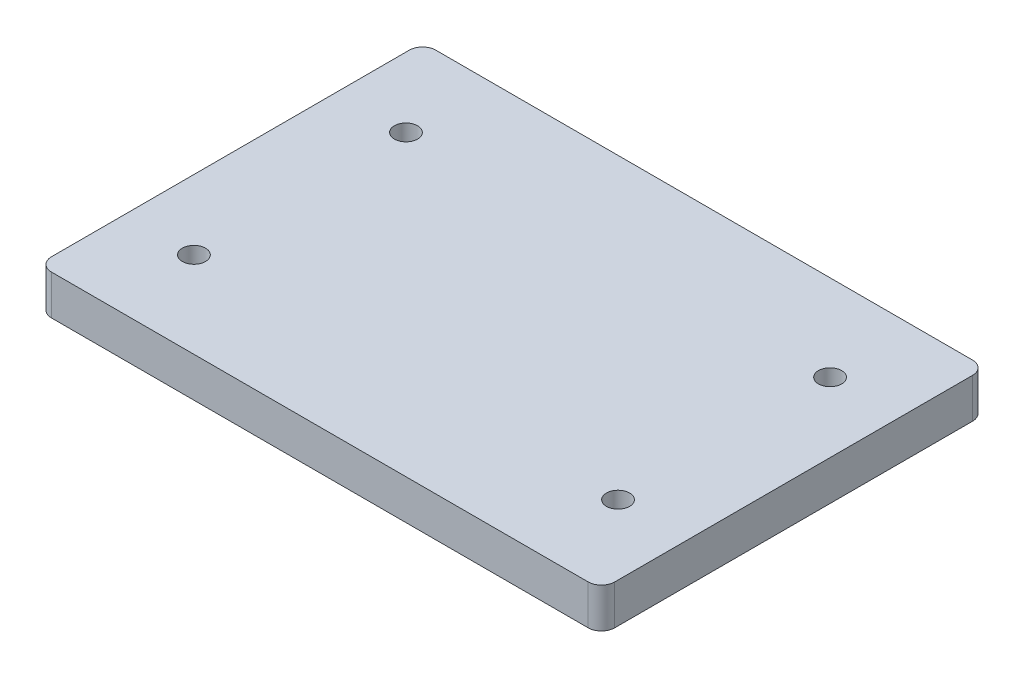
ISO-10303-21;
HEADER;
FILE_DESCRIPTION(('STEP AP214'),'2;1');
FILE_NAME('part.step','',(''),(''),'','','');
FILE_SCHEMA(('AUTOMOTIVE_DESIGN { 1 0 10303 214 1 1 1 1 }'));
ENDSEC;
DATA;
#1=APPLICATION_CONTEXT('core data for automotive mechanical design processes');
#2=APPLICATION_PROTOCOL_DEFINITION('international standard','automotive_design',2000,#1);
#3=PRODUCT_CONTEXT('',#1,'mechanical');
#4=PRODUCT('Part','Part','',(#3));
#5=PRODUCT_RELATED_PRODUCT_CATEGORY('part','',(#4));
#6=PRODUCT_DEFINITION_FORMATION('','',#4);
#7=PRODUCT_DEFINITION_CONTEXT('part definition',#1,'design');
#8=PRODUCT_DEFINITION('design','',#6,#7);
#9=PRODUCT_DEFINITION_SHAPE('','',#8);
#10=(LENGTH_UNIT() NAMED_UNIT(*) SI_UNIT(.MILLI.,.METRE.));
#11=(NAMED_UNIT(*) PLANE_ANGLE_UNIT() SI_UNIT($,.RADIAN.));
#12=(NAMED_UNIT(*) SI_UNIT($,.STERADIAN.) SOLID_ANGLE_UNIT());
#13=UNCERTAINTY_MEASURE_WITH_UNIT(LENGTH_MEASURE(1.E-05),#10,'distance_accuracy_value','');
#14=(GEOMETRIC_REPRESENTATION_CONTEXT(3) GLOBAL_UNCERTAINTY_ASSIGNED_CONTEXT((#13)) GLOBAL_UNIT_ASSIGNED_CONTEXT((#10,
#11,#12)) REPRESENTATION_CONTEXT('',''));
#15=CARTESIAN_POINT('',(0.,0.,0.));
#16=DIRECTION('',(0.,0.,1.));
#17=DIRECTION('',(1.,0.,0.));
#18=AXIS2_PLACEMENT_3D('',#15,#16,#17);
#19=CARTESIAN_POINT('',(42.5,6.,29.));
#20=DIRECTION('',(-1.,0.,0.));
#21=DIRECTION('',(0.,0.,1.));
#22=AXIS2_PLACEMENT_3D('',#19,#20,#21);
#23=PLANE('',#22);
#24=DIRECTION('',(0.,0.,-1.));
#25=VECTOR('',#24,1.);
#26=CARTESIAN_POINT('',(42.5,0.,29.));
#27=LINE('',#26,#25);
#28=CARTESIAN_POINT('',(42.5,0.,27.));
#29=VERTEX_POINT('',#28);
#30=CARTESIAN_POINT('',(42.5,0.,-27.));
#31=VERTEX_POINT('',#30);
#32=EDGE_CURVE('E136',#29,#31,#27,.T.);
#33=ORIENTED_EDGE('',*,*,#32,.T.);
#34=DIRECTION('',(0.,-1.,0.));
#35=VECTOR('',#34,1.);
#36=CARTESIAN_POINT('',(42.5,6.,-27.));
#37=LINE('',#36,#35);
#38=CARTESIAN_POINT('',(42.5,6.,-27.));
#39=VERTEX_POINT('',#38);
#40=EDGE_CURVE('E159',#31,#39,#37,.F.);
#41=ORIENTED_EDGE('',*,*,#40,.T.);
#42=DIRECTION('',(0.,0.,-1.));
#43=VECTOR('',#42,1.);
#44=CARTESIAN_POINT('',(42.5,6.,29.));
#45=LINE('',#44,#43);
#46=CARTESIAN_POINT('',(42.5,6.,27.));
#47=VERTEX_POINT('',#46);
#48=EDGE_CURVE('E134',#47,#39,#45,.T.);
#49=ORIENTED_EDGE('',*,*,#48,.F.);
#50=DIRECTION('',(0.,-1.,0.));
#51=VECTOR('',#50,1.);
#52=CARTESIAN_POINT('',(42.5,6.,27.));
#53=LINE('',#52,#51);
#54=EDGE_CURVE('E156',#47,#29,#53,.T.);
#55=ORIENTED_EDGE('',*,*,#54,.T.);
#56=EDGE_LOOP('',(#33,#41,#49,#55));
#57=FACE_BOUND('',#56,.T.);
#58=ADVANCED_FACE('F41',(#57),#23,.F.);
#59=CARTESIAN_POINT('',(-42.5,6.,-29.));
#60=DIRECTION('',(0.,0.,1.));
#61=DIRECTION('',(1.,0.,0.));
#62=AXIS2_PLACEMENT_3D('',#59,#60,#61);
#63=PLANE('',#62);
#64=DIRECTION('',(-1.,0.,0.));
#65=VECTOR('',#64,1.);
#66=CARTESIAN_POINT('',(-42.5,0.,-29.));
#67=LINE('',#66,#65);
#68=CARTESIAN_POINT('',(40.5,0.,-29.));
#69=VERTEX_POINT('',#68);
#70=CARTESIAN_POINT('',(-40.5,0.,-29.));
#71=VERTEX_POINT('',#70);
#72=EDGE_CURVE('E132',#69,#71,#67,.T.);
#73=ORIENTED_EDGE('',*,*,#72,.T.);
#74=DIRECTION('',(0.,-1.,0.));
#75=VECTOR('',#74,1.);
#76=CARTESIAN_POINT('',(-40.5,6.,-29.));
#77=LINE('',#76,#75);
#78=CARTESIAN_POINT('',(-40.5,6.,-29.));
#79=VERTEX_POINT('',#78);
#80=EDGE_CURVE('E111',#71,#79,#77,.F.);
#81=ORIENTED_EDGE('',*,*,#80,.T.);
#82=DIRECTION('',(-1.,0.,0.));
#83=VECTOR('',#82,1.);
#84=CARTESIAN_POINT('',(-42.5,6.,-29.));
#85=LINE('',#84,#83);
#86=CARTESIAN_POINT('',(40.5,6.,-29.));
#87=VERTEX_POINT('',#86);
#88=EDGE_CURVE('E175',#87,#79,#85,.T.);
#89=ORIENTED_EDGE('',*,*,#88,.F.);
#90=DIRECTION('',(0.,-1.,0.));
#91=VECTOR('',#90,1.);
#92=CARTESIAN_POINT('',(40.5,6.,-29.));
#93=LINE('',#92,#91);
#94=EDGE_CURVE('E116',#87,#69,#93,.T.);
#95=ORIENTED_EDGE('',*,*,#94,.T.);
#96=EDGE_LOOP('',(#73,#81,#89,#95));
#97=FACE_BOUND('',#96,.T.);
#98=ADVANCED_FACE('F220',(#97),#63,.F.);
#99=CARTESIAN_POINT('',(-42.5,6.,29.));
#100=DIRECTION('',(1.,0.,0.));
#101=DIRECTION('',(0.,0.,-1.));
#102=AXIS2_PLACEMENT_3D('',#99,#100,#101);
#103=PLANE('',#102);
#104=DIRECTION('',(0.,0.,1.));
#105=VECTOR('',#104,1.);
#106=CARTESIAN_POINT('',(-42.5,6.,29.));
#107=LINE('',#106,#105);
#108=CARTESIAN_POINT('',(-42.5,6.,-27.));
#109=VERTEX_POINT('',#108);
#110=CARTESIAN_POINT('',(-42.5,6.,27.));
#111=VERTEX_POINT('',#110);
#112=EDGE_CURVE('E125',#109,#111,#107,.T.);
#113=ORIENTED_EDGE('',*,*,#112,.F.);
#114=DIRECTION('',(0.,-1.,0.));
#115=VECTOR('',#114,1.);
#116=CARTESIAN_POINT('',(-42.5,6.,-27.));
#117=LINE('',#116,#115);
#118=CARTESIAN_POINT('',(-42.5,0.,-27.));
#119=VERTEX_POINT('',#118);
#120=EDGE_CURVE('E110',#109,#119,#117,.T.);
#121=ORIENTED_EDGE('',*,*,#120,.T.);
#122=DIRECTION('',(0.,0.,1.));
#123=VECTOR('',#122,1.);
#124=CARTESIAN_POINT('',(-42.5,0.,29.));
#125=LINE('',#124,#123);
#126=CARTESIAN_POINT('',(-42.5,0.,27.));
#127=VERTEX_POINT('',#126);
#128=EDGE_CURVE('E123',#119,#127,#125,.T.);
#129=ORIENTED_EDGE('',*,*,#128,.T.);
#130=DIRECTION('',(0.,-1.,0.));
#131=VECTOR('',#130,1.);
#132=CARTESIAN_POINT('',(-42.5,6.,27.));
#133=LINE('',#132,#131);
#134=EDGE_CURVE('E127',#127,#111,#133,.F.);
#135=ORIENTED_EDGE('',*,*,#134,.T.);
#136=EDGE_LOOP('',(#113,#121,#129,#135));
#137=FACE_BOUND('',#136,.T.);
#138=ADVANCED_FACE('F122',(#137),#103,.F.);
#139=CARTESIAN_POINT('',(-42.5,6.,29.));
#140=DIRECTION('',(0.,0.,-1.));
#141=DIRECTION('',(-1.,0.,0.));
#142=AXIS2_PLACEMENT_3D('',#139,#140,#141);
#143=PLANE('',#142);
#144=DIRECTION('',(1.,0.,0.));
#145=VECTOR('',#144,1.);
#146=CARTESIAN_POINT('',(-42.5,0.,29.));
#147=LINE('',#146,#145);
#148=CARTESIAN_POINT('',(-40.5,0.,29.));
#149=VERTEX_POINT('',#148);
#150=CARTESIAN_POINT('',(40.5,0.,29.));
#151=VERTEX_POINT('',#150);
#152=EDGE_CURVE('E131',#149,#151,#147,.T.);
#153=ORIENTED_EDGE('',*,*,#152,.T.);
#154=DIRECTION('',(0.,-1.,0.));
#155=VECTOR('',#154,1.);
#156=CARTESIAN_POINT('',(40.5,6.,29.));
#157=LINE('',#156,#155);
#158=CARTESIAN_POINT('',(40.5,6.,29.));
#159=VERTEX_POINT('',#158);
#160=EDGE_CURVE('E11',#151,#159,#157,.F.);
#161=ORIENTED_EDGE('',*,*,#160,.T.);
#162=DIRECTION('',(1.,0.,0.));
#163=VECTOR('',#162,1.);
#164=CARTESIAN_POINT('',(-42.5,6.,29.));
#165=LINE('',#164,#163);
#166=CARTESIAN_POINT('',(-40.5,6.,29.));
#167=VERTEX_POINT('',#166);
#168=EDGE_CURVE('E140',#167,#159,#165,.T.);
#169=ORIENTED_EDGE('',*,*,#168,.F.);
#170=DIRECTION('',(0.,-1.,0.));
#171=VECTOR('',#170,1.);
#172=CARTESIAN_POINT('',(-40.5,6.,29.));
#173=LINE('',#172,#171);
#174=EDGE_CURVE('E49',#167,#149,#173,.T.);
#175=ORIENTED_EDGE('',*,*,#174,.T.);
#176=EDGE_LOOP('',(#153,#161,#169,#175));
#177=FACE_BOUND('',#176,.T.);
#178=ADVANCED_FACE('F162',(#177),#143,.F.);
#179=CARTESIAN_POINT('',(0.,6.,0.));
#180=DIRECTION('',(0.,-1.,0.));
#181=DIRECTION('',(0.,0.,-1.));
#182=AXIS2_PLACEMENT_3D('',#179,#180,#181);
#183=PLANE('',#182);
#184=CARTESIAN_POINT('',(-32.,6.,16.));
#185=DIRECTION('',(0.,1.,0.));
#186=DIRECTION('',(0.,0.,-1.));
#187=AXIS2_PLACEMENT_3D('',#184,#185,#186);
#188=CIRCLE('',#187,1.75);
#189=CARTESIAN_POINT('',(-32.,6.,14.25));
#190=VERTEX_POINT('',#189);
#191=EDGE_CURVE('E194',#190,#190,#188,.T.);
#192=ORIENTED_EDGE('',*,*,#191,.F.);
#193=EDGE_LOOP('',(#192));
#194=FACE_BOUND('',#193,.T.);
#195=CARTESIAN_POINT('',(32.,6.,16.));
#196=DIRECTION('',(0.,1.,0.));
#197=DIRECTION('',(0.,0.,1.));
#198=AXIS2_PLACEMENT_3D('',#195,#196,#197);
#199=CIRCLE('',#198,1.75);
#200=CARTESIAN_POINT('',(32.,6.,17.75));
#201=VERTEX_POINT('',#200);
#202=EDGE_CURVE('E200',#201,#201,#199,.T.);
#203=ORIENTED_EDGE('',*,*,#202,.F.);
#204=EDGE_LOOP('',(#203));
#205=FACE_BOUND('',#204,.T.);
#206=CARTESIAN_POINT('',(32.,6.,-16.));
#207=DIRECTION('',(0.,1.,0.));
#208=DIRECTION('',(0.,0.,-1.));
#209=AXIS2_PLACEMENT_3D('',#206,#207,#208);
#210=CIRCLE('',#209,1.75);
#211=CARTESIAN_POINT('',(32.,6.,-17.75));
#212=VERTEX_POINT('',#211);
#213=EDGE_CURVE('E189',#212,#212,#210,.T.);
#214=ORIENTED_EDGE('',*,*,#213,.F.);
#215=EDGE_LOOP('',(#214));
#216=FACE_BOUND('',#215,.T.);
#217=CARTESIAN_POINT('',(-32.,6.,-16.));
#218=DIRECTION('',(0.,1.,0.));
#219=DIRECTION('',(0.,0.,1.));
#220=AXIS2_PLACEMENT_3D('',#217,#218,#219);
#221=CIRCLE('',#220,1.75);
#222=CARTESIAN_POINT('',(-32.,6.,-14.25));
#223=VERTEX_POINT('',#222);
#224=EDGE_CURVE('E180',#223,#223,#221,.T.);
#225=ORIENTED_EDGE('',*,*,#224,.F.);
#226=EDGE_LOOP('',(#225));
#227=FACE_BOUND('',#226,.T.);
#228=ORIENTED_EDGE('',*,*,#88,.T.);
#229=CARTESIAN_POINT('',(-40.5,6.,-27.));
#230=DIRECTION('',(0.,-1.,0.));
#231=DIRECTION('',(0.,0.,-1.));
#232=AXIS2_PLACEMENT_3D('',#229,#230,#231);
#233=CIRCLE('',#232,2.);
#234=EDGE_CURVE('E154',#79,#109,#233,.F.);
#235=ORIENTED_EDGE('',*,*,#234,.T.);
#236=ORIENTED_EDGE('',*,*,#112,.T.);
#237=CARTESIAN_POINT('',(-40.5,6.,27.));
#238=DIRECTION('',(0.,-1.,0.));
#239=DIRECTION('',(0.,0.,-1.));
#240=AXIS2_PLACEMENT_3D('',#237,#238,#239);
#241=CIRCLE('',#240,2.);
#242=EDGE_CURVE('E61',#111,#167,#241,.F.);
#243=ORIENTED_EDGE('',*,*,#242,.T.);
#244=ORIENTED_EDGE('',*,*,#168,.T.);
#245=CARTESIAN_POINT('',(40.5,6.,27.));
#246=DIRECTION('',(0.,-1.,0.));
#247=DIRECTION('',(0.,0.,-1.));
#248=AXIS2_PLACEMENT_3D('',#245,#246,#247);
#249=CIRCLE('',#248,2.);
#250=EDGE_CURVE('E150',#159,#47,#249,.F.);
#251=ORIENTED_EDGE('',*,*,#250,.T.);
#252=ORIENTED_EDGE('',*,*,#48,.T.);
#253=CARTESIAN_POINT('',(40.5,6.,-27.));
#254=DIRECTION('',(0.,-1.,0.));
#255=DIRECTION('',(0.,0.,-1.));
#256=AXIS2_PLACEMENT_3D('',#253,#254,#255);
#257=CIRCLE('',#256,2.);
#258=EDGE_CURVE('E152',#39,#87,#257,.F.);
#259=ORIENTED_EDGE('',*,*,#258,.T.);
#260=EDGE_LOOP('',(#228,#235,#236,#243,#244,#251,#252,#259));
#261=FACE_BOUND('',#260,.T.);
#262=ADVANCED_FACE('F211',(#194,#205,#216,#227,#261),#183,.F.);
#263=CARTESIAN_POINT('',(0.,0.,0.));
#264=DIRECTION('',(0.,-1.,0.));
#265=DIRECTION('',(0.,0.,-1.));
#266=AXIS2_PLACEMENT_3D('',#263,#264,#265);
#267=PLANE('',#266);
#268=CARTESIAN_POINT('',(-32.,0.,16.));
#269=DIRECTION('',(0.,1.,0.));
#270=DIRECTION('',(0.,0.,-1.));
#271=AXIS2_PLACEMENT_3D('',#268,#269,#270);
#272=CIRCLE('',#271,1.75);
#273=CARTESIAN_POINT('',(-32.,0.,14.25));
#274=VERTEX_POINT('',#273);
#275=EDGE_CURVE('E191',#274,#274,#272,.T.);
#276=ORIENTED_EDGE('',*,*,#275,.T.);
#277=EDGE_LOOP('',(#276));
#278=FACE_BOUND('',#277,.T.);
#279=CARTESIAN_POINT('',(32.,0.,16.));
#280=DIRECTION('',(0.,1.,0.));
#281=DIRECTION('',(0.,0.,1.));
#282=AXIS2_PLACEMENT_3D('',#279,#280,#281);
#283=CIRCLE('',#282,1.75);
#284=CARTESIAN_POINT('',(32.,0.,17.75));
#285=VERTEX_POINT('',#284);
#286=EDGE_CURVE('E197',#285,#285,#283,.T.);
#287=ORIENTED_EDGE('',*,*,#286,.T.);
#288=EDGE_LOOP('',(#287));
#289=FACE_BOUND('',#288,.T.);
#290=CARTESIAN_POINT('',(32.,0.,-16.));
#291=DIRECTION('',(0.,1.,0.));
#292=DIRECTION('',(0.,0.,-1.));
#293=AXIS2_PLACEMENT_3D('',#290,#291,#292);
#294=CIRCLE('',#293,1.75);
#295=CARTESIAN_POINT('',(32.,0.,-17.75));
#296=VERTEX_POINT('',#295);
#297=EDGE_CURVE('E203',#296,#296,#294,.T.);
#298=ORIENTED_EDGE('',*,*,#297,.T.);
#299=EDGE_LOOP('',(#298));
#300=FACE_BOUND('',#299,.T.);
#301=CARTESIAN_POINT('',(-32.,0.,-16.));
#302=DIRECTION('',(0.,1.,0.));
#303=DIRECTION('',(0.,0.,1.));
#304=AXIS2_PLACEMENT_3D('',#301,#302,#303);
#305=CIRCLE('',#304,1.75);
#306=CARTESIAN_POINT('',(-32.,0.,-14.25));
#307=VERTEX_POINT('',#306);
#308=EDGE_CURVE('E184',#307,#307,#305,.T.);
#309=ORIENTED_EDGE('',*,*,#308,.T.);
#310=EDGE_LOOP('',(#309));
#311=FACE_BOUND('',#310,.T.);
#312=ORIENTED_EDGE('',*,*,#128,.F.);
#313=CARTESIAN_POINT('',(-40.5,0.,-27.));
#314=DIRECTION('',(0.,-1.,0.));
#315=DIRECTION('',(0.,0.,-1.));
#316=AXIS2_PLACEMENT_3D('',#313,#314,#315);
#317=CIRCLE('',#316,2.);
#318=EDGE_CURVE('E106',#119,#71,#317,.T.);
#319=ORIENTED_EDGE('',*,*,#318,.T.);
#320=ORIENTED_EDGE('',*,*,#72,.F.);
#321=CARTESIAN_POINT('',(40.5,0.,-27.));
#322=DIRECTION('',(0.,-1.,0.));
#323=DIRECTION('',(0.,0.,-1.));
#324=AXIS2_PLACEMENT_3D('',#321,#322,#323);
#325=CIRCLE('',#324,2.);
#326=EDGE_CURVE('E117',#69,#31,#325,.T.);
#327=ORIENTED_EDGE('',*,*,#326,.T.);
#328=ORIENTED_EDGE('',*,*,#32,.F.);
#329=CARTESIAN_POINT('',(40.5,0.,27.));
#330=DIRECTION('',(0.,-1.,0.));
#331=DIRECTION('',(0.,0.,-1.));
#332=AXIS2_PLACEMENT_3D('',#329,#330,#331);
#333=CIRCLE('',#332,2.);
#334=EDGE_CURVE('E143',#29,#151,#333,.T.);
#335=ORIENTED_EDGE('',*,*,#334,.T.);
#336=ORIENTED_EDGE('',*,*,#152,.F.);
#337=CARTESIAN_POINT('',(-40.5,0.,27.));
#338=DIRECTION('',(0.,-1.,0.));
#339=DIRECTION('',(0.,0.,-1.));
#340=AXIS2_PLACEMENT_3D('',#337,#338,#339);
#341=CIRCLE('',#340,2.);
#342=EDGE_CURVE('E126',#149,#127,#341,.T.);
#343=ORIENTED_EDGE('',*,*,#342,.T.);
#344=EDGE_LOOP('',(#312,#319,#320,#327,#328,#335,#336,#343));
#345=FACE_BOUND('',#344,.T.);
#346=ADVANCED_FACE('F129',(#278,#289,#300,#311,#345),#267,.T.);
#347=CARTESIAN_POINT('',(-40.5,6.,-27.));
#348=DIRECTION('',(0.,-1.,0.));
#349=DIRECTION('',(0.,0.,-1.));
#350=AXIS2_PLACEMENT_3D('',#347,#348,#349);
#351=CYLINDRICAL_SURFACE('',#350,2.);
#352=ORIENTED_EDGE('',*,*,#234,.F.);
#353=ORIENTED_EDGE('',*,*,#80,.F.);
#354=ORIENTED_EDGE('',*,*,#318,.F.);
#355=ORIENTED_EDGE('',*,*,#120,.F.);
#356=EDGE_LOOP('',(#352,#353,#354,#355));
#357=FACE_BOUND('',#356,.T.);
#358=ADVANCED_FACE('F109',(#357),#351,.T.);
#359=CARTESIAN_POINT('',(40.5,6.,-27.));
#360=DIRECTION('',(0.,-1.,0.));
#361=DIRECTION('',(0.,0.,-1.));
#362=AXIS2_PLACEMENT_3D('',#359,#360,#361);
#363=CYLINDRICAL_SURFACE('',#362,2.);
#364=ORIENTED_EDGE('',*,*,#258,.F.);
#365=ORIENTED_EDGE('',*,*,#40,.F.);
#366=ORIENTED_EDGE('',*,*,#326,.F.);
#367=ORIENTED_EDGE('',*,*,#94,.F.);
#368=EDGE_LOOP('',(#364,#365,#366,#367));
#369=FACE_BOUND('',#368,.T.);
#370=ADVANCED_FACE('F222',(#369),#363,.T.);
#371=CARTESIAN_POINT('',(40.5,6.,27.));
#372=DIRECTION('',(0.,-1.,0.));
#373=DIRECTION('',(0.,0.,-1.));
#374=AXIS2_PLACEMENT_3D('',#371,#372,#373);
#375=CYLINDRICAL_SURFACE('',#374,2.);
#376=ORIENTED_EDGE('',*,*,#250,.F.);
#377=ORIENTED_EDGE('',*,*,#160,.F.);
#378=ORIENTED_EDGE('',*,*,#334,.F.);
#379=ORIENTED_EDGE('',*,*,#54,.F.);
#380=EDGE_LOOP('',(#376,#377,#378,#379));
#381=FACE_BOUND('',#380,.T.);
#382=ADVANCED_FACE('F169',(#381),#375,.T.);
#383=CARTESIAN_POINT('',(-40.5,6.,27.));
#384=DIRECTION('',(0.,-1.,0.));
#385=DIRECTION('',(0.,0.,-1.));
#386=AXIS2_PLACEMENT_3D('',#383,#384,#385);
#387=CYLINDRICAL_SURFACE('',#386,2.);
#388=ORIENTED_EDGE('',*,*,#242,.F.);
#389=ORIENTED_EDGE('',*,*,#134,.F.);
#390=ORIENTED_EDGE('',*,*,#342,.F.);
#391=ORIENTED_EDGE('',*,*,#174,.F.);
#392=EDGE_LOOP('',(#388,#389,#390,#391));
#393=FACE_BOUND('',#392,.T.);
#394=ADVANCED_FACE('F43',(#393),#387,.T.);
#395=CARTESIAN_POINT('',(-32.,0.,-16.));
#396=DIRECTION('',(0.,1.,0.));
#397=DIRECTION('',(0.,0.,1.));
#398=AXIS2_PLACEMENT_3D('',#395,#396,#397);
#399=CYLINDRICAL_SURFACE('',#398,1.75);
#400=ORIENTED_EDGE('',*,*,#308,.F.);
#401=EDGE_LOOP('',(#400));
#402=FACE_BOUND('',#401,.T.);
#403=ORIENTED_EDGE('',*,*,#224,.T.);
#404=EDGE_LOOP('',(#403));
#405=FACE_BOUND('',#404,.T.);
#406=ADVANCED_FACE('F244',(#402,#405),#399,.F.);
#407=CARTESIAN_POINT('',(32.,0.,-16.));
#408=DIRECTION('',(0.,1.,0.));
#409=DIRECTION('',(0.,0.,1.));
#410=AXIS2_PLACEMENT_3D('',#407,#408,#409);
#411=CYLINDRICAL_SURFACE('',#410,1.75);
#412=ORIENTED_EDGE('',*,*,#297,.F.);
#413=EDGE_LOOP('',(#412));
#414=FACE_BOUND('',#413,.T.);
#415=ORIENTED_EDGE('',*,*,#213,.T.);
#416=EDGE_LOOP('',(#415));
#417=FACE_BOUND('',#416,.T.);
#418=ADVANCED_FACE('F209',(#414,#417),#411,.F.);
#419=CARTESIAN_POINT('',(32.,0.,16.));
#420=DIRECTION('',(0.,1.,0.));
#421=DIRECTION('',(0.,0.,1.));
#422=AXIS2_PLACEMENT_3D('',#419,#420,#421);
#423=CYLINDRICAL_SURFACE('',#422,1.75);
#424=ORIENTED_EDGE('',*,*,#286,.F.);
#425=EDGE_LOOP('',(#424));
#426=FACE_BOUND('',#425,.T.);
#427=ORIENTED_EDGE('',*,*,#202,.T.);
#428=EDGE_LOOP('',(#427));
#429=FACE_BOUND('',#428,.T.);
#430=ADVANCED_FACE('F251',(#426,#429),#423,.F.);
#431=CARTESIAN_POINT('',(-32.,0.,16.));
#432=DIRECTION('',(0.,1.,0.));
#433=DIRECTION('',(0.,0.,1.));
#434=AXIS2_PLACEMENT_3D('',#431,#432,#433);
#435=CYLINDRICAL_SURFACE('',#434,1.75);
#436=ORIENTED_EDGE('',*,*,#275,.F.);
#437=EDGE_LOOP('',(#436));
#438=FACE_BOUND('',#437,.T.);
#439=ORIENTED_EDGE('',*,*,#191,.T.);
#440=EDGE_LOOP('',(#439));
#441=FACE_BOUND('',#440,.T.);
#442=ADVANCED_FACE('F248',(#438,#441),#435,.F.);
#443=CLOSED_SHELL('',(#58,#98,#138,#178,#262,#346,#358,#370,#382,#394,#406,#418,#430,#442));
#444=MANIFOLD_SOLID_BREP('B2',#443);
#445=ADVANCED_BREP_SHAPE_REPRESENTATION('',(#18,#444),#14);
#446=SHAPE_DEFINITION_REPRESENTATION(#9,#445);
ENDSEC;
END-ISO-10303-21;
